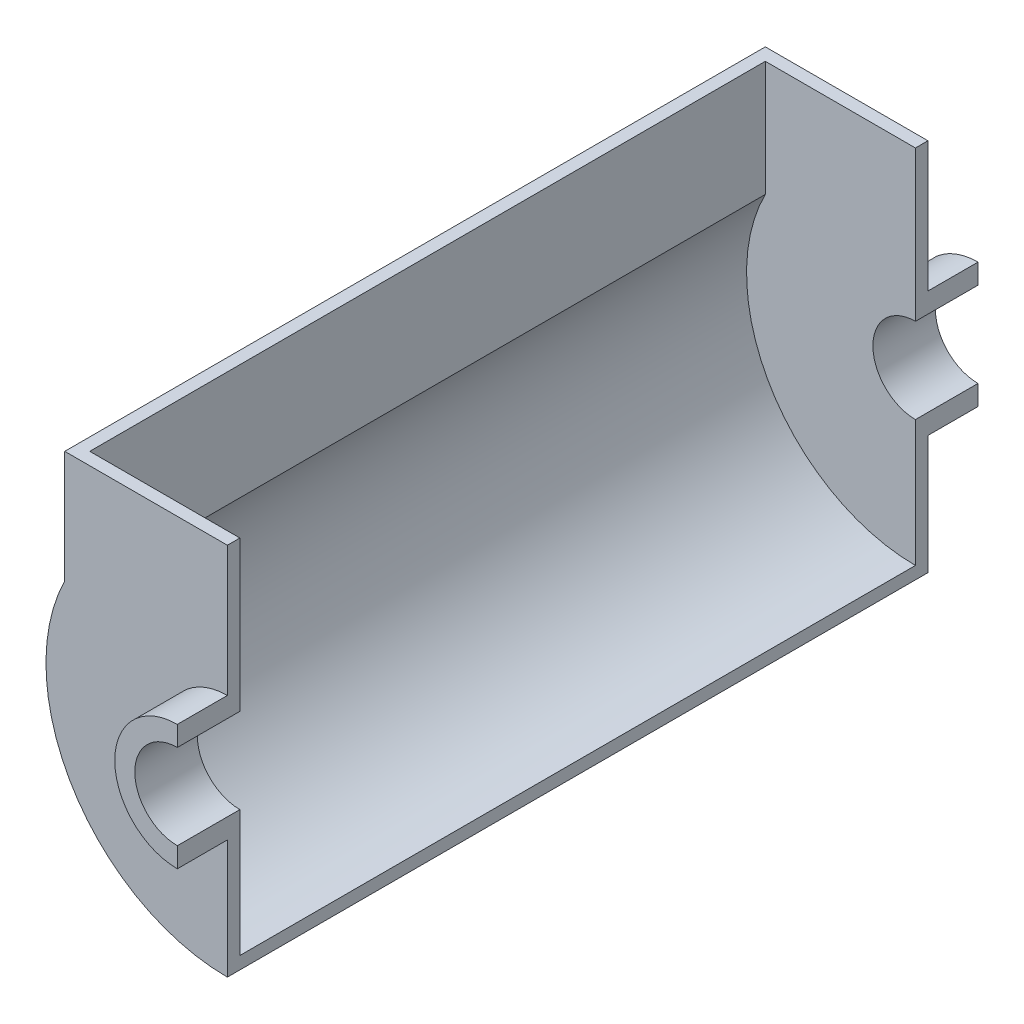
ISO-10303-21;
HEADER;
FILE_DESCRIPTION(('STEP AP214'),'2;1');
FILE_NAME('part.step','',(''),(''),'','','');
FILE_SCHEMA(('AUTOMOTIVE_DESIGN { 1 0 10303 214 1 1 1 1 }'));
ENDSEC;
DATA;
#1=APPLICATION_CONTEXT('core data for automotive mechanical design processes');
#2=APPLICATION_PROTOCOL_DEFINITION('international standard','automotive_design',2000,#1);
#3=PRODUCT_CONTEXT('',#1,'mechanical');
#4=PRODUCT('Part','Part','',(#3));
#5=PRODUCT_RELATED_PRODUCT_CATEGORY('part','',(#4));
#6=PRODUCT_DEFINITION_FORMATION('','',#4);
#7=PRODUCT_DEFINITION_CONTEXT('part definition',#1,'design');
#8=PRODUCT_DEFINITION('design','',#6,#7);
#9=PRODUCT_DEFINITION_SHAPE('','',#8);
#10=(LENGTH_UNIT() NAMED_UNIT(*) SI_UNIT(.MILLI.,.METRE.));
#11=(NAMED_UNIT(*) PLANE_ANGLE_UNIT() SI_UNIT($,.RADIAN.));
#12=(NAMED_UNIT(*) SI_UNIT($,.STERADIAN.) SOLID_ANGLE_UNIT());
#13=UNCERTAINTY_MEASURE_WITH_UNIT(LENGTH_MEASURE(1.E-05),#10,'distance_accuracy_value','');
#14=(GEOMETRIC_REPRESENTATION_CONTEXT(3) GLOBAL_UNCERTAINTY_ASSIGNED_CONTEXT((#13)) GLOBAL_UNIT_ASSIGNED_CONTEXT((#10,
#11,#12)) REPRESENTATION_CONTEXT('',''));
#15=CARTESIAN_POINT('',(0.,0.,0.));
#16=DIRECTION('',(0.,0.,1.));
#17=DIRECTION('',(1.,0.,0.));
#18=AXIS2_PLACEMENT_3D('',#15,#16,#17);
#19=CARTESIAN_POINT('',(0.,0.,-5.));
#20=DIRECTION('',(0.,0.,1.));
#21=DIRECTION('',(1.,0.,0.));
#22=AXIS2_PLACEMENT_3D('',#19,#20,#21);
#23=PLANE('',#22);
#24=CARTESIAN_POINT('',(0.,0.,-5.));
#25=DIRECTION('',(0.,0.,1.));
#26=DIRECTION('',(-1.,0.,0.));
#27=AXIS2_PLACEMENT_3D('',#24,#25,#26);
#28=CIRCLE('',#27,67.5);
#29=CARTESIAN_POINT('',(-60.,30.9232921921324,-5.));
#30=VERTEX_POINT('',#29);
#31=CARTESIAN_POINT('',(0.,-67.5,-5.));
#32=VERTEX_POINT('',#31);
#33=EDGE_CURVE('E38',#30,#32,#28,.T.);
#34=ORIENTED_EDGE('',*,*,#33,.F.);
#35=DIRECTION('',(0.,-1.,0.));
#36=VECTOR('',#35,1.);
#37=CARTESIAN_POINT('',(-60.,30.9232921921325,-5.));
#38=LINE('',#37,#36);
#39=CARTESIAN_POINT('',(-60.,77.,-5.));
#40=VERTEX_POINT('',#39);
#41=EDGE_CURVE('E52',#40,#30,#38,.T.);
#42=ORIENTED_EDGE('',*,*,#41,.F.);
#43=DIRECTION('',(-1.,0.,0.));
#44=VECTOR('',#43,1.);
#45=CARTESIAN_POINT('',(0.,77.,-5.));
#46=LINE('',#45,#44);
#47=CARTESIAN_POINT('',(0.,77.,-5.));
#48=VERTEX_POINT('',#47);
#49=EDGE_CURVE('E260',#48,#40,#46,.T.);
#50=ORIENTED_EDGE('',*,*,#49,.F.);
#51=DIRECTION('',(0.,1.,0.));
#52=VECTOR('',#51,1.);
#53=CARTESIAN_POINT('',(0.,25.,-5.));
#54=LINE('',#53,#52);
#55=CARTESIAN_POINT('',(0.,17.,-5.));
#56=VERTEX_POINT('',#55);
#57=EDGE_CURVE('E316',#56,#48,#54,.T.);
#58=ORIENTED_EDGE('',*,*,#57,.F.);
#59=CARTESIAN_POINT('',(0.,0.,-5.));
#60=DIRECTION('',(0.,0.,-1.));
#61=DIRECTION('',(1.,0.,0.));
#62=AXIS2_PLACEMENT_3D('',#59,#60,#61);
#63=CIRCLE('',#62,17.);
#64=CARTESIAN_POINT('',(0.,-17.,-5.));
#65=VERTEX_POINT('',#64);
#66=EDGE_CURVE('E313',#65,#56,#63,.T.);
#67=ORIENTED_EDGE('',*,*,#66,.F.);
#68=DIRECTION('',(0.,1.,0.));
#69=VECTOR('',#68,1.);
#70=CARTESIAN_POINT('',(0.,-17.,-5.));
#71=LINE('',#70,#69);
#72=EDGE_CURVE('E58',#32,#65,#71,.T.);
#73=ORIENTED_EDGE('',*,*,#72,.F.);
#74=EDGE_LOOP('',(#34,#42,#50,#58,#67,#73));
#75=FACE_BOUND('',#74,.T.);
#76=ADVANCED_FACE('F34',(#75),#23,.F.);
#77=CARTESIAN_POINT('',(0.,0.,-5.));
#78=DIRECTION('',(0.,0.,1.));
#79=DIRECTION('',(1.,0.,0.));
#80=AXIS2_PLACEMENT_3D('',#77,#78,#79);
#81=CYLINDRICAL_SURFACE('',#80,17.);
#82=DIRECTION('',(0.,0.,1.));
#83=VECTOR('',#82,1.);
#84=CARTESIAN_POINT('',(0.,17.,-5.));
#85=LINE('',#84,#83);
#86=CARTESIAN_POINT('',(0.,17.,20.));
#87=VERTEX_POINT('',#86);
#88=EDGE_CURVE('E321',#56,#87,#85,.T.);
#89=ORIENTED_EDGE('',*,*,#88,.T.);
#90=CARTESIAN_POINT('',(0.,0.,20.));
#91=DIRECTION('',(0.,0.,-1.));
#92=DIRECTION('',(1.,0.,0.));
#93=AXIS2_PLACEMENT_3D('',#90,#91,#92);
#94=CIRCLE('',#93,17.);
#95=CARTESIAN_POINT('',(0.,-17.,20.));
#96=VERTEX_POINT('',#95);
#97=EDGE_CURVE('E296',#96,#87,#94,.T.);
#98=ORIENTED_EDGE('',*,*,#97,.F.);
#99=DIRECTION('',(0.,0.,1.));
#100=VECTOR('',#99,1.);
#101=CARTESIAN_POINT('',(0.,-17.,-5.));
#102=LINE('',#101,#100);
#103=EDGE_CURVE('E11',#65,#96,#102,.T.);
#104=ORIENTED_EDGE('',*,*,#103,.F.);
#105=ORIENTED_EDGE('',*,*,#66,.T.);
#106=EDGE_LOOP('',(#89,#98,#104,#105));
#107=FACE_BOUND('',#106,.T.);
#108=ADVANCED_FACE('F36',(#107),#81,.F.);
#109=CARTESIAN_POINT('',(0.,-17.,-5.));
#110=DIRECTION('',(1.,0.,0.));
#111=DIRECTION('',(0.,0.,-1.));
#112=AXIS2_PLACEMENT_3D('',#109,#110,#111);
#113=PLANE('',#112);
#114=ORIENTED_EDGE('',*,*,#103,.T.);
#115=DIRECTION('',(0.,1.,0.));
#116=VECTOR('',#115,1.);
#117=CARTESIAN_POINT('',(0.,-17.,20.));
#118=LINE('',#117,#116);
#119=CARTESIAN_POINT('',(0.,-25.,20.));
#120=VERTEX_POINT('',#119);
#121=EDGE_CURVE('E310',#120,#96,#118,.T.);
#122=ORIENTED_EDGE('',*,*,#121,.F.);
#123=DIRECTION('',(0.,0.,1.));
#124=VECTOR('',#123,1.);
#125=CARTESIAN_POINT('',(0.,-25.,-5.));
#126=LINE('',#125,#124);
#127=CARTESIAN_POINT('',(0.,-25.,0.));
#128=VERTEX_POINT('',#127);
#129=EDGE_CURVE('E44',#128,#120,#126,.T.);
#130=ORIENTED_EDGE('',*,*,#129,.F.);
#131=DIRECTION('',(0.,1.,0.));
#132=VECTOR('',#131,1.);
#133=CARTESIAN_POINT('',(0.,-25.,0.));
#134=LINE('',#133,#132);
#135=CARTESIAN_POINT('',(0.,-72.5,0.));
#136=VERTEX_POINT('',#135);
#137=EDGE_CURVE('E277',#136,#128,#134,.T.);
#138=ORIENTED_EDGE('',*,*,#137,.F.);
#139=DIRECTION('',(0.,0.,1.));
#140=VECTOR('',#139,1.);
#141=CARTESIAN_POINT('',(0.,-72.5,-5.));
#142=LINE('',#141,#140);
#143=CARTESIAN_POINT('',(0.,-72.5,-280.));
#144=VERTEX_POINT('',#143);
#145=EDGE_CURVE('E241',#144,#136,#142,.T.);
#146=ORIENTED_EDGE('',*,*,#145,.F.);
#147=DIRECTION('',(0.,1.,0.));
#148=VECTOR('',#147,1.);
#149=CARTESIAN_POINT('',(0.,-25.,-280.));
#150=LINE('',#149,#148);
#151=CARTESIAN_POINT('',(0.,-25.,-280.));
#152=VERTEX_POINT('',#151);
#153=EDGE_CURVE('E188',#144,#152,#150,.T.);
#154=ORIENTED_EDGE('',*,*,#153,.T.);
#155=DIRECTION('',(0.,0.,-1.));
#156=VECTOR('',#155,1.);
#157=CARTESIAN_POINT('',(0.,-25.,-275.));
#158=LINE('',#157,#156);
#159=CARTESIAN_POINT('',(0.,-25.,-300.));
#160=VERTEX_POINT('',#159);
#161=EDGE_CURVE('E202',#152,#160,#158,.T.);
#162=ORIENTED_EDGE('',*,*,#161,.T.);
#163=DIRECTION('',(0.,1.,0.));
#164=VECTOR('',#163,1.);
#165=CARTESIAN_POINT('',(0.,-17.,-300.));
#166=LINE('',#165,#164);
#167=CARTESIAN_POINT('',(0.,-17.,-300.));
#168=VERTEX_POINT('',#167);
#169=EDGE_CURVE('E232',#160,#168,#166,.T.);
#170=ORIENTED_EDGE('',*,*,#169,.T.);
#171=DIRECTION('',(0.,0.,-1.));
#172=VECTOR('',#171,1.);
#173=CARTESIAN_POINT('',(0.,-17.,-275.));
#174=LINE('',#173,#172);
#175=CARTESIAN_POINT('',(0.,-17.,-275.));
#176=VERTEX_POINT('',#175);
#177=EDGE_CURVE('E199',#176,#168,#174,.T.);
#178=ORIENTED_EDGE('',*,*,#177,.F.);
#179=DIRECTION('',(0.,1.,0.));
#180=VECTOR('',#179,1.);
#181=CARTESIAN_POINT('',(0.,-17.,-275.));
#182=LINE('',#181,#180);
#183=CARTESIAN_POINT('',(0.,-67.5,-275.));
#184=VERTEX_POINT('',#183);
#185=EDGE_CURVE('E189',#184,#176,#182,.T.);
#186=ORIENTED_EDGE('',*,*,#185,.F.);
#187=DIRECTION('',(0.,0.,1.));
#188=VECTOR('',#187,1.);
#189=CARTESIAN_POINT('',(0.,-67.5,-306.152038807834));
#190=LINE('',#189,#188);
#191=EDGE_CURVE('E159',#184,#32,#190,.T.);
#192=ORIENTED_EDGE('',*,*,#191,.T.);
#193=ORIENTED_EDGE('',*,*,#72,.T.);
#194=EDGE_LOOP('',(#114,#122,#130,#138,#146,#154,#162,#170,#178,#186,#192,#193));
#195=FACE_BOUND('',#194,.T.);
#196=ADVANCED_FACE('F234',(#195),#113,.T.);
#197=CARTESIAN_POINT('',(0.,0.,-5.));
#198=DIRECTION('',(0.,0.,1.));
#199=DIRECTION('',(1.,0.,0.));
#200=AXIS2_PLACEMENT_3D('',#197,#198,#199);
#201=CYLINDRICAL_SURFACE('',#200,25.);
#202=CARTESIAN_POINT('',(0.,0.,0.));
#203=DIRECTION('',(0.,0.,-1.));
#204=DIRECTION('',(1.,0.,0.));
#205=AXIS2_PLACEMENT_3D('',#202,#203,#204);
#206=CIRCLE('',#205,25.);
#207=CARTESIAN_POINT('',(0.,25.,0.));
#208=VERTEX_POINT('',#207);
#209=EDGE_CURVE('E261',#128,#208,#206,.T.);
#210=ORIENTED_EDGE('',*,*,#209,.F.);
#211=ORIENTED_EDGE('',*,*,#129,.T.);
#212=CARTESIAN_POINT('',(0.,0.,20.));
#213=DIRECTION('',(0.,0.,1.));
#214=DIRECTION('',(1.,0.,0.));
#215=AXIS2_PLACEMENT_3D('',#212,#213,#214);
#216=CIRCLE('',#215,25.);
#217=CARTESIAN_POINT('',(0.,25.,20.));
#218=VERTEX_POINT('',#217);
#219=EDGE_CURVE('E307',#218,#120,#216,.T.);
#220=ORIENTED_EDGE('',*,*,#219,.F.);
#221=DIRECTION('',(0.,0.,1.));
#222=VECTOR('',#221,1.);
#223=CARTESIAN_POINT('',(0.,25.,-5.));
#224=LINE('',#223,#222);
#225=EDGE_CURVE('E320',#208,#218,#224,.T.);
#226=ORIENTED_EDGE('',*,*,#225,.F.);
#227=EDGE_LOOP('',(#210,#211,#220,#226));
#228=FACE_BOUND('',#227,.T.);
#229=ADVANCED_FACE('F338',(#228),#201,.T.);
#230=CARTESIAN_POINT('',(0.,25.,-5.));
#231=DIRECTION('',(1.,0.,0.));
#232=DIRECTION('',(0.,0.,-1.));
#233=AXIS2_PLACEMENT_3D('',#230,#231,#232);
#234=PLANE('',#233);
#235=ORIENTED_EDGE('',*,*,#57,.T.);
#236=DIRECTION('',(0.,0.,1.));
#237=VECTOR('',#236,1.);
#238=CARTESIAN_POINT('',(0.,77.,-5.));
#239=LINE('',#238,#237);
#240=CARTESIAN_POINT('',(0.,77.,0.));
#241=VERTEX_POINT('',#240);
#242=EDGE_CURVE('E276',#48,#241,#239,.T.);
#243=ORIENTED_EDGE('',*,*,#242,.T.);
#244=DIRECTION('',(0.,1.,0.));
#245=VECTOR('',#244,1.);
#246=CARTESIAN_POINT('',(0.,25.,0.));
#247=LINE('',#246,#245);
#248=EDGE_CURVE('E264',#208,#241,#247,.T.);
#249=ORIENTED_EDGE('',*,*,#248,.F.);
#250=ORIENTED_EDGE('',*,*,#225,.T.);
#251=DIRECTION('',(0.,1.,0.));
#252=VECTOR('',#251,1.);
#253=CARTESIAN_POINT('',(0.,25.,20.));
#254=LINE('',#253,#252);
#255=EDGE_CURVE('E304',#87,#218,#254,.T.);
#256=ORIENTED_EDGE('',*,*,#255,.F.);
#257=ORIENTED_EDGE('',*,*,#88,.F.);
#258=EDGE_LOOP('',(#235,#243,#249,#250,#256,#257));
#259=FACE_BOUND('',#258,.T.);
#260=ADVANCED_FACE('F329',(#259),#234,.T.);
#261=CARTESIAN_POINT('',(0.,0.,20.));
#262=DIRECTION('',(0.,0.,1.));
#263=DIRECTION('',(1.,0.,0.));
#264=AXIS2_PLACEMENT_3D('',#261,#262,#263);
#265=PLANE('',#264);
#266=ORIENTED_EDGE('',*,*,#97,.T.);
#267=ORIENTED_EDGE('',*,*,#255,.T.);
#268=ORIENTED_EDGE('',*,*,#219,.T.);
#269=ORIENTED_EDGE('',*,*,#121,.T.);
#270=EDGE_LOOP('',(#266,#267,#268,#269));
#271=FACE_BOUND('',#270,.T.);
#272=ADVANCED_FACE('F337',(#271),#265,.T.);
#273=CARTESIAN_POINT('',(0.,0.,-5.));
#274=DIRECTION('',(0.,0.,1.));
#275=DIRECTION('',(1.,0.,0.));
#276=AXIS2_PLACEMENT_3D('',#273,#274,#275);
#277=CYLINDRICAL_SURFACE('',#276,72.5);
#278=CARTESIAN_POINT('',(0.,0.,0.));
#279=DIRECTION('',(0.,0.,1.));
#280=DIRECTION('',(1.,0.,0.));
#281=AXIS2_PLACEMENT_3D('',#278,#279,#280);
#282=CIRCLE('',#281,72.5);
#283=CARTESIAN_POINT('',(-65.,32.1130814466628,0.));
#284=VERTEX_POINT('',#283);
#285=EDGE_CURVE('E290',#284,#136,#282,.T.);
#286=ORIENTED_EDGE('',*,*,#285,.F.);
#287=DIRECTION('',(0.,0.,1.));
#288=VECTOR('',#287,1.);
#289=CARTESIAN_POINT('',(-65.,32.1130814466628,-5.));
#290=LINE('',#289,#288);
#291=CARTESIAN_POINT('',(-65.,32.1130814466628,-280.));
#292=VERTEX_POINT('',#291);
#293=EDGE_CURVE('E297',#292,#284,#290,.T.);
#294=ORIENTED_EDGE('',*,*,#293,.F.);
#295=CARTESIAN_POINT('',(0.,0.,-280.));
#296=DIRECTION('',(0.,0.,1.));
#297=DIRECTION('',(1.,0.,0.));
#298=AXIS2_PLACEMENT_3D('',#295,#296,#297);
#299=CIRCLE('',#298,72.5);
#300=EDGE_CURVE('E245',#292,#144,#299,.T.);
#301=ORIENTED_EDGE('',*,*,#300,.T.);
#302=ORIENTED_EDGE('',*,*,#145,.T.);
#303=EDGE_LOOP('',(#286,#294,#301,#302));
#304=FACE_BOUND('',#303,.T.);
#305=ADVANCED_FACE('F342',(#304),#277,.T.);
#306=CARTESIAN_POINT('',(-65.,77.,-5.));
#307=DIRECTION('',(-1.,0.,0.));
#308=DIRECTION('',(0.,-1.,0.));
#309=AXIS2_PLACEMENT_3D('',#306,#307,#308);
#310=PLANE('',#309);
#311=DIRECTION('',(0.,-1.,0.));
#312=VECTOR('',#311,1.);
#313=CARTESIAN_POINT('',(-65.,77.,0.));
#314=LINE('',#313,#312);
#315=CARTESIAN_POINT('',(-65.,77.,0.));
#316=VERTEX_POINT('',#315);
#317=EDGE_CURVE('E287',#316,#284,#314,.T.);
#318=ORIENTED_EDGE('',*,*,#317,.F.);
#319=DIRECTION('',(0.,0.,1.));
#320=VECTOR('',#319,1.);
#321=CARTESIAN_POINT('',(-65.,77.,-5.));
#322=LINE('',#321,#320);
#323=CARTESIAN_POINT('',(-65.,77.,-280.));
#324=VERTEX_POINT('',#323);
#325=EDGE_CURVE('E299',#324,#316,#322,.T.);
#326=ORIENTED_EDGE('',*,*,#325,.F.);
#327=DIRECTION('',(0.,-1.,0.));
#328=VECTOR('',#327,1.);
#329=CARTESIAN_POINT('',(-65.,77.,-280.));
#330=LINE('',#329,#328);
#331=EDGE_CURVE('E246',#324,#292,#330,.T.);
#332=ORIENTED_EDGE('',*,*,#331,.T.);
#333=ORIENTED_EDGE('',*,*,#293,.T.);
#334=EDGE_LOOP('',(#318,#326,#332,#333));
#335=FACE_BOUND('',#334,.T.);
#336=ADVANCED_FACE('F344',(#335),#310,.T.);
#337=CARTESIAN_POINT('',(0.,77.,-5.));
#338=DIRECTION('',(0.,1.,0.));
#339=DIRECTION('',(-1.,0.,0.));
#340=AXIS2_PLACEMENT_3D('',#337,#338,#339);
#341=PLANE('',#340);
#342=DIRECTION('',(-1.,0.,0.));
#343=VECTOR('',#342,1.);
#344=CARTESIAN_POINT('',(0.,77.,0.));
#345=LINE('',#344,#343);
#346=EDGE_CURVE('E284',#241,#316,#345,.T.);
#347=ORIENTED_EDGE('',*,*,#346,.F.);
#348=ORIENTED_EDGE('',*,*,#242,.F.);
#349=ORIENTED_EDGE('',*,*,#49,.T.);
#350=DIRECTION('',(0.,0.,1.));
#351=VECTOR('',#350,1.);
#352=CARTESIAN_POINT('',(-60.,77.,-306.152038807834));
#353=LINE('',#352,#351);
#354=CARTESIAN_POINT('',(-60.,77.,-275.));
#355=VERTEX_POINT('',#354);
#356=EDGE_CURVE('E158',#355,#40,#353,.T.);
#357=ORIENTED_EDGE('',*,*,#356,.F.);
#358=DIRECTION('',(-1.,0.,0.));
#359=VECTOR('',#358,1.);
#360=CARTESIAN_POINT('',(0.,77.,-275.));
#361=LINE('',#360,#359);
#362=CARTESIAN_POINT('',(0.,77.,-275.));
#363=VERTEX_POINT('',#362);
#364=EDGE_CURVE('E168',#363,#355,#361,.T.);
#365=ORIENTED_EDGE('',*,*,#364,.F.);
#366=DIRECTION('',(0.,0.,-1.));
#367=VECTOR('',#366,1.);
#368=CARTESIAN_POINT('',(0.,77.,-275.));
#369=LINE('',#368,#367);
#370=CARTESIAN_POINT('',(0.,77.,-280.));
#371=VERTEX_POINT('',#370);
#372=EDGE_CURVE('E187',#363,#371,#369,.T.);
#373=ORIENTED_EDGE('',*,*,#372,.T.);
#374=DIRECTION('',(-1.,0.,0.));
#375=VECTOR('',#374,1.);
#376=CARTESIAN_POINT('',(0.,77.,-280.));
#377=LINE('',#376,#375);
#378=EDGE_CURVE('E251',#371,#324,#377,.T.);
#379=ORIENTED_EDGE('',*,*,#378,.T.);
#380=ORIENTED_EDGE('',*,*,#325,.T.);
#381=EDGE_LOOP('',(#347,#348,#349,#357,#365,#373,#379,#380));
#382=FACE_BOUND('',#381,.T.);
#383=ADVANCED_FACE('F258',(#382),#341,.T.);
#384=CARTESIAN_POINT('',(0.,0.,0.));
#385=DIRECTION('',(0.,0.,1.));
#386=DIRECTION('',(1.,0.,0.));
#387=AXIS2_PLACEMENT_3D('',#384,#385,#386);
#388=PLANE('',#387);
#389=ORIENTED_EDGE('',*,*,#209,.T.);
#390=ORIENTED_EDGE('',*,*,#248,.T.);
#391=ORIENTED_EDGE('',*,*,#346,.T.);
#392=ORIENTED_EDGE('',*,*,#317,.T.);
#393=ORIENTED_EDGE('',*,*,#285,.T.);
#394=ORIENTED_EDGE('',*,*,#137,.T.);
#395=EDGE_LOOP('',(#389,#390,#391,#392,#393,#394));
#396=FACE_BOUND('',#395,.T.);
#397=ADVANCED_FACE('F333',(#396),#388,.T.);
#398=CARTESIAN_POINT('',(0.,0.,-306.152038807834));
#399=DIRECTION('',(0.,0.,1.));
#400=DIRECTION('',(1.,0.,0.));
#401=AXIS2_PLACEMENT_3D('',#398,#399,#400);
#402=CYLINDRICAL_SURFACE('',#401,67.5);
#403=ORIENTED_EDGE('',*,*,#191,.F.);
#404=CARTESIAN_POINT('',(0.,0.,-275.));
#405=DIRECTION('',(0.,0.,1.));
#406=DIRECTION('',(-1.,0.,0.));
#407=AXIS2_PLACEMENT_3D('',#404,#405,#406);
#408=CIRCLE('',#407,67.5);
#409=CARTESIAN_POINT('',(-60.,30.9232921921324,-275.));
#410=VERTEX_POINT('',#409);
#411=EDGE_CURVE('E165',#410,#184,#408,.T.);
#412=ORIENTED_EDGE('',*,*,#411,.F.);
#413=DIRECTION('',(0.,0.,1.));
#414=VECTOR('',#413,1.);
#415=CARTESIAN_POINT('',(-60.,30.9232921921324,-306.152038807834));
#416=LINE('',#415,#414);
#417=EDGE_CURVE('E149',#410,#30,#416,.T.);
#418=ORIENTED_EDGE('',*,*,#417,.T.);
#419=ORIENTED_EDGE('',*,*,#33,.T.);
#420=EDGE_LOOP('',(#403,#412,#418,#419));
#421=FACE_BOUND('',#420,.T.);
#422=ADVANCED_FACE('F170',(#421),#402,.F.);
#423=CARTESIAN_POINT('',(-60.,30.9232921921325,-306.152038807834));
#424=DIRECTION('',(-1.,0.,0.));
#425=DIRECTION('',(0.,0.,1.));
#426=AXIS2_PLACEMENT_3D('',#423,#424,#425);
#427=PLANE('',#426);
#428=ORIENTED_EDGE('',*,*,#417,.F.);
#429=DIRECTION('',(0.,-1.,0.));
#430=VECTOR('',#429,1.);
#431=CARTESIAN_POINT('',(-60.,30.9232921921325,-275.));
#432=LINE('',#431,#430);
#433=EDGE_CURVE('E153',#355,#410,#432,.T.);
#434=ORIENTED_EDGE('',*,*,#433,.F.);
#435=ORIENTED_EDGE('',*,*,#356,.T.);
#436=ORIENTED_EDGE('',*,*,#41,.T.);
#437=EDGE_LOOP('',(#428,#434,#435,#436));
#438=FACE_BOUND('',#437,.T.);
#439=ADVANCED_FACE('F151',(#438),#427,.F.);
#440=CARTESIAN_POINT('',(0.,0.,-275.));
#441=DIRECTION('',(0.,0.,-1.));
#442=DIRECTION('',(1.,0.,0.));
#443=AXIS2_PLACEMENT_3D('',#440,#441,#442);
#444=PLANE('',#443);
#445=ORIENTED_EDGE('',*,*,#411,.T.);
#446=ORIENTED_EDGE('',*,*,#185,.T.);
#447=CARTESIAN_POINT('',(0.,0.,-275.));
#448=DIRECTION('',(0.,0.,-1.));
#449=DIRECTION('',(1.,0.,0.));
#450=AXIS2_PLACEMENT_3D('',#447,#448,#449);
#451=CIRCLE('',#450,17.);
#452=CARTESIAN_POINT('',(0.,17.,-275.));
#453=VERTEX_POINT('',#452);
#454=EDGE_CURVE('E219',#176,#453,#451,.T.);
#455=ORIENTED_EDGE('',*,*,#454,.T.);
#456=DIRECTION('',(0.,1.,0.));
#457=VECTOR('',#456,1.);
#458=CARTESIAN_POINT('',(0.,25.,-275.));
#459=LINE('',#458,#457);
#460=EDGE_CURVE('E193',#453,#363,#459,.T.);
#461=ORIENTED_EDGE('',*,*,#460,.T.);
#462=ORIENTED_EDGE('',*,*,#364,.T.);
#463=ORIENTED_EDGE('',*,*,#433,.T.);
#464=EDGE_LOOP('',(#445,#446,#455,#461,#462,#463));
#465=FACE_BOUND('',#464,.T.);
#466=ADVANCED_FACE('F163',(#465),#444,.F.);
#467=CARTESIAN_POINT('',(0.,0.,-275.));
#468=DIRECTION('',(0.,0.,-1.));
#469=DIRECTION('',(1.,0.,0.));
#470=AXIS2_PLACEMENT_3D('',#467,#468,#469);
#471=CYLINDRICAL_SURFACE('',#470,17.);
#472=DIRECTION('',(0.,0.,-1.));
#473=VECTOR('',#472,1.);
#474=CARTESIAN_POINT('',(0.,17.,-275.));
#475=LINE('',#474,#473);
#476=CARTESIAN_POINT('',(0.,17.,-300.));
#477=VERTEX_POINT('',#476);
#478=EDGE_CURVE('E192',#453,#477,#475,.T.);
#479=ORIENTED_EDGE('',*,*,#478,.F.);
#480=ORIENTED_EDGE('',*,*,#454,.F.);
#481=ORIENTED_EDGE('',*,*,#177,.T.);
#482=CARTESIAN_POINT('',(0.,0.,-300.));
#483=DIRECTION('',(0.,0.,-1.));
#484=DIRECTION('',(1.,0.,0.));
#485=AXIS2_PLACEMENT_3D('',#482,#483,#484);
#486=CIRCLE('',#485,17.);
#487=EDGE_CURVE('E221',#168,#477,#486,.T.);
#488=ORIENTED_EDGE('',*,*,#487,.T.);
#489=EDGE_LOOP('',(#479,#480,#481,#488));
#490=FACE_BOUND('',#489,.T.);
#491=ADVANCED_FACE('F218',(#490),#471,.F.);
#492=CARTESIAN_POINT('',(0.,0.,-275.));
#493=DIRECTION('',(0.,0.,-1.));
#494=DIRECTION('',(1.,0.,0.));
#495=AXIS2_PLACEMENT_3D('',#492,#493,#494);
#496=CYLINDRICAL_SURFACE('',#495,25.);
#497=CARTESIAN_POINT('',(0.,0.,-280.));
#498=DIRECTION('',(0.,0.,-1.));
#499=DIRECTION('',(1.,0.,0.));
#500=AXIS2_PLACEMENT_3D('',#497,#498,#499);
#501=CIRCLE('',#500,25.);
#502=CARTESIAN_POINT('',(0.,25.,-280.));
#503=VERTEX_POINT('',#502);
#504=EDGE_CURVE('E172',#152,#503,#501,.T.);
#505=ORIENTED_EDGE('',*,*,#504,.T.);
#506=DIRECTION('',(0.,0.,-1.));
#507=VECTOR('',#506,1.);
#508=CARTESIAN_POINT('',(0.,25.,-275.));
#509=LINE('',#508,#507);
#510=CARTESIAN_POINT('',(0.,25.,-300.));
#511=VERTEX_POINT('',#510);
#512=EDGE_CURVE('E204',#503,#511,#509,.T.);
#513=ORIENTED_EDGE('',*,*,#512,.T.);
#514=CARTESIAN_POINT('',(0.,0.,-300.));
#515=DIRECTION('',(0.,0.,1.));
#516=DIRECTION('',(1.,0.,0.));
#517=AXIS2_PLACEMENT_3D('',#514,#515,#516);
#518=CIRCLE('',#517,25.);
#519=EDGE_CURVE('E225',#511,#160,#518,.T.);
#520=ORIENTED_EDGE('',*,*,#519,.T.);
#521=ORIENTED_EDGE('',*,*,#161,.F.);
#522=EDGE_LOOP('',(#505,#513,#520,#521));
#523=FACE_BOUND('',#522,.T.);
#524=ADVANCED_FACE('F238',(#523),#496,.T.);
#525=CARTESIAN_POINT('',(0.,25.,-275.));
#526=DIRECTION('',(1.,0.,0.));
#527=DIRECTION('',(0.,0.,1.));
#528=AXIS2_PLACEMENT_3D('',#525,#526,#527);
#529=PLANE('',#528);
#530=ORIENTED_EDGE('',*,*,#460,.F.);
#531=ORIENTED_EDGE('',*,*,#478,.T.);
#532=DIRECTION('',(0.,1.,0.));
#533=VECTOR('',#532,1.);
#534=CARTESIAN_POINT('',(0.,25.,-300.));
#535=LINE('',#534,#533);
#536=EDGE_CURVE('E212',#477,#511,#535,.T.);
#537=ORIENTED_EDGE('',*,*,#536,.T.);
#538=ORIENTED_EDGE('',*,*,#512,.F.);
#539=DIRECTION('',(0.,1.,0.));
#540=VECTOR('',#539,1.);
#541=CARTESIAN_POINT('',(0.,25.,-280.));
#542=LINE('',#541,#540);
#543=EDGE_CURVE('E175',#503,#371,#542,.T.);
#544=ORIENTED_EDGE('',*,*,#543,.T.);
#545=ORIENTED_EDGE('',*,*,#372,.F.);
#546=EDGE_LOOP('',(#530,#531,#537,#538,#544,#545));
#547=FACE_BOUND('',#546,.T.);
#548=ADVANCED_FACE('F211',(#547),#529,.T.);
#549=CARTESIAN_POINT('',(0.,0.,-300.));
#550=DIRECTION('',(0.,0.,-1.));
#551=DIRECTION('',(1.,0.,0.));
#552=AXIS2_PLACEMENT_3D('',#549,#550,#551);
#553=PLANE('',#552);
#554=ORIENTED_EDGE('',*,*,#487,.F.);
#555=ORIENTED_EDGE('',*,*,#169,.F.);
#556=ORIENTED_EDGE('',*,*,#519,.F.);
#557=ORIENTED_EDGE('',*,*,#536,.F.);
#558=EDGE_LOOP('',(#554,#555,#556,#557));
#559=FACE_BOUND('',#558,.T.);
#560=ADVANCED_FACE('F237',(#559),#553,.T.);
#561=CARTESIAN_POINT('',(0.,0.,-280.));
#562=DIRECTION('',(0.,0.,-1.));
#563=DIRECTION('',(1.,0.,0.));
#564=AXIS2_PLACEMENT_3D('',#561,#562,#563);
#565=PLANE('',#564);
#566=ORIENTED_EDGE('',*,*,#504,.F.);
#567=ORIENTED_EDGE('',*,*,#153,.F.);
#568=ORIENTED_EDGE('',*,*,#300,.F.);
#569=ORIENTED_EDGE('',*,*,#331,.F.);
#570=ORIENTED_EDGE('',*,*,#378,.F.);
#571=ORIENTED_EDGE('',*,*,#543,.F.);
#572=EDGE_LOOP('',(#566,#567,#568,#569,#570,#571));
#573=FACE_BOUND('',#572,.T.);
#574=ADVANCED_FACE('F254',(#573),#565,.T.);
#575=CLOSED_SHELL('',(#76,#108,#196,#229,#260,#272,#305,#336,#383,#397,#422,#439,#466,#491,#524,
#548,#560,#574));
#576=MANIFOLD_SOLID_BREP('B2',#575);
#577=ADVANCED_BREP_SHAPE_REPRESENTATION('',(#18,#576),#14);
#578=SHAPE_DEFINITION_REPRESENTATION(#9,#577);
ENDSEC;
END-ISO-10303-21;
